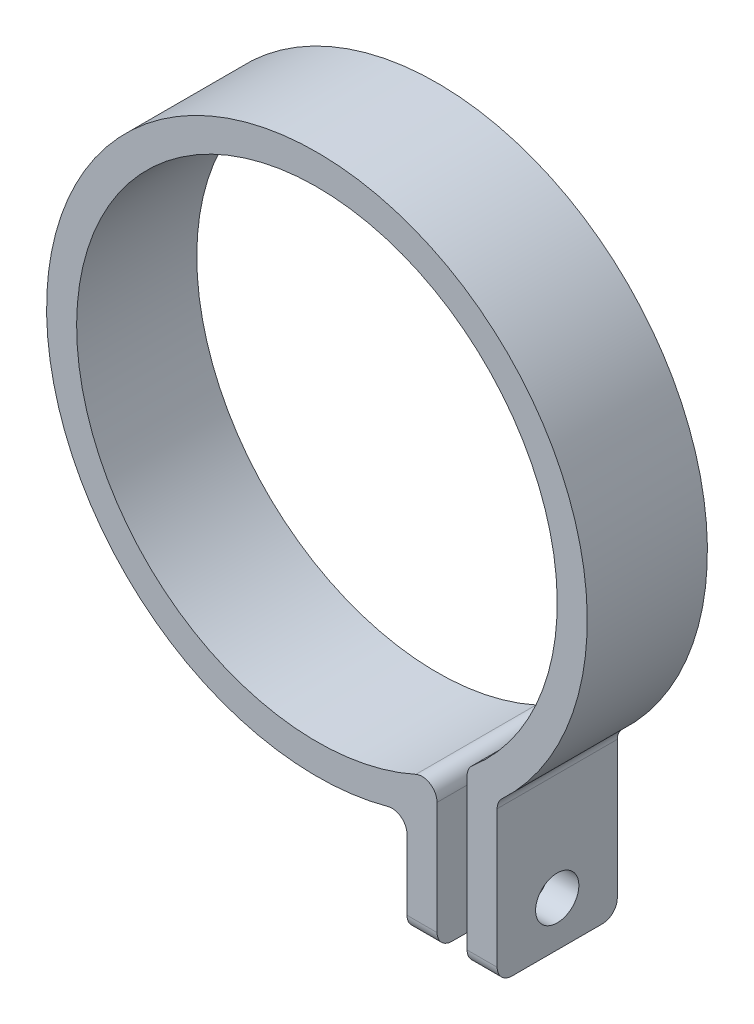
ISO-10303-21;
HEADER;
FILE_DESCRIPTION(('STEP AP214'),'2;1');
FILE_NAME('part.step','',(''),(''),'','','');
FILE_SCHEMA(('AUTOMOTIVE_DESIGN { 1 0 10303 214 1 1 1 1 }'));
ENDSEC;
DATA;
#1=APPLICATION_CONTEXT('core data for automotive mechanical design processes');
#2=APPLICATION_PROTOCOL_DEFINITION('international standard','automotive_design',2000,#1);
#3=PRODUCT_CONTEXT('',#1,'mechanical');
#4=PRODUCT('Part','Part','',(#3));
#5=PRODUCT_RELATED_PRODUCT_CATEGORY('part','',(#4));
#6=PRODUCT_DEFINITION_FORMATION('','',#4);
#7=PRODUCT_DEFINITION_CONTEXT('part definition',#1,'design');
#8=PRODUCT_DEFINITION('design','',#6,#7);
#9=PRODUCT_DEFINITION_SHAPE('','',#8);
#10=(LENGTH_UNIT() NAMED_UNIT(*) SI_UNIT(.MILLI.,.METRE.));
#11=(NAMED_UNIT(*) PLANE_ANGLE_UNIT() SI_UNIT($,.RADIAN.));
#12=(NAMED_UNIT(*) SI_UNIT($,.STERADIAN.) SOLID_ANGLE_UNIT());
#13=UNCERTAINTY_MEASURE_WITH_UNIT(LENGTH_MEASURE(1.E-05),#10,'distance_accuracy_value','');
#14=(GEOMETRIC_REPRESENTATION_CONTEXT(3) GLOBAL_UNCERTAINTY_ASSIGNED_CONTEXT((#13)) GLOBAL_UNIT_ASSIGNED_CONTEXT((#10,
#11,#12)) REPRESENTATION_CONTEXT('',''));
#15=CARTESIAN_POINT('',(0.,0.,0.));
#16=DIRECTION('',(0.,0.,1.));
#17=DIRECTION('',(1.,0.,0.));
#18=AXIS2_PLACEMENT_3D('',#15,#16,#17);
#19=CARTESIAN_POINT('',(0.,0.,6.35));
#20=DIRECTION('',(0.,0.,-1.));
#21=DIRECTION('',(-1.,0.,0.));
#22=AXIS2_PLACEMENT_3D('',#19,#20,#21);
#23=CYLINDRICAL_SURFACE('',#22,25.4);
#24=CARTESIAN_POINT('',(0.,0.,6.35));
#25=DIRECTION('',(0.,0.,-1.));
#26=DIRECTION('',(1.,0.,0.));
#27=AXIS2_PLACEMENT_3D('',#24,#25,#26);
#28=CIRCLE('',#27,25.4);
#29=CARTESIAN_POINT('',(10.4588235294118,-23.1467710573337,6.35));
#30=VERTEX_POINT('',#29);
#31=CARTESIAN_POINT('',(16.4352941176471,-19.365978087007,6.35));
#32=VERTEX_POINT('',#31);
#33=EDGE_CURVE('E338',#30,#32,#28,.T.);
#34=ORIENTED_EDGE('',*,*,#33,.F.);
#35=DIRECTION('',(0.,0.,-1.));
#36=VECTOR('',#35,1.);
#37=CARTESIAN_POINT('',(10.4588235294118,-23.1467710573337,6.35));
#38=LINE('',#37,#36);
#39=CARTESIAN_POINT('',(10.4588235294118,-23.1467710573337,-6.35));
#40=VERTEX_POINT('',#39);
#41=EDGE_CURVE('E273',#30,#40,#38,.T.);
#42=ORIENTED_EDGE('',*,*,#41,.T.);
#43=CARTESIAN_POINT('',(0.,0.,-6.35));
#44=DIRECTION('',(0.,0.,-1.));
#45=DIRECTION('',(1.,0.,0.));
#46=AXIS2_PLACEMENT_3D('',#43,#44,#45);
#47=CIRCLE('',#46,25.4);
#48=CARTESIAN_POINT('',(16.4352941176471,-19.365978087007,-6.35));
#49=VERTEX_POINT('',#48);
#50=EDGE_CURVE('E323',#40,#49,#47,.T.);
#51=ORIENTED_EDGE('',*,*,#50,.T.);
#52=DIRECTION('',(0.,0.,-1.));
#53=VECTOR('',#52,1.);
#54=CARTESIAN_POINT('',(16.4352941176471,-19.365978087007,6.35));
#55=LINE('',#54,#53);
#56=EDGE_CURVE('E270',#49,#32,#55,.F.);
#57=ORIENTED_EDGE('',*,*,#56,.T.);
#58=EDGE_LOOP('',(#34,#42,#51,#57));
#59=FACE_BOUND('',#58,.T.);
#60=ADVANCED_FACE('F45',(#59),#23,.F.);
#61=CARTESIAN_POINT('',(15.875,-19.8278686449149,6.35));
#62=DIRECTION('',(1.,0.,0.));
#63=DIRECTION('',(0.,1.,0.));
#64=AXIS2_PLACEMENT_3D('',#61,#62,#63);
#65=PLANE('',#64);
#66=CARTESIAN_POINT('',(15.875,-33.3375,0.));
#67=DIRECTION('',(1.,0.,0.));
#68=DIRECTION('',(0.,1.,0.));
#69=AXIS2_PLACEMENT_3D('',#66,#67,#68);
#70=CIRCLE('',#69,2.286);
#71=CARTESIAN_POINT('',(15.875,-31.0515,0.));
#72=VERTEX_POINT('',#71);
#73=EDGE_CURVE('E326',#72,#72,#70,.T.);
#74=ORIENTED_EDGE('',*,*,#73,.T.);
#75=EDGE_LOOP('',(#74));
#76=FACE_BOUND('',#75,.T.);
#77=DIRECTION('',(0.,-1.,0.));
#78=VECTOR('',#77,1.);
#79=CARTESIAN_POINT('',(15.875,-19.8278686449149,-6.35));
#80=LINE('',#79,#78);
#81=CARTESIAN_POINT('',(15.875,-20.576351717445,-6.35));
#82=VERTEX_POINT('',#81);
#83=CARTESIAN_POINT('',(15.875,-36.5125,-6.35));
#84=VERTEX_POINT('',#83);
#85=EDGE_CURVE('E301',#82,#84,#80,.T.);
#86=ORIENTED_EDGE('',*,*,#85,.T.);
#87=CARTESIAN_POINT('',(15.875,-36.5125,-4.7625));
#88=DIRECTION('',(1.,0.,0.));
#89=DIRECTION('',(0.,1.,0.));
#90=AXIS2_PLACEMENT_3D('',#87,#88,#89);
#91=CIRCLE('',#90,1.5875);
#92=CARTESIAN_POINT('',(15.875,-38.1,-4.7625));
#93=VERTEX_POINT('',#92);
#94=EDGE_CURVE('E250',#84,#93,#91,.F.);
#95=ORIENTED_EDGE('',*,*,#94,.T.);
#96=DIRECTION('',(0.,0.,-1.));
#97=VECTOR('',#96,1.);
#98=CARTESIAN_POINT('',(15.875,-38.1,6.35));
#99=LINE('',#98,#97);
#100=CARTESIAN_POINT('',(15.875,-38.1,4.7625));
#101=VERTEX_POINT('',#100);
#102=EDGE_CURVE('E202',#101,#93,#99,.T.);
#103=ORIENTED_EDGE('',*,*,#102,.F.);
#104=CARTESIAN_POINT('',(15.875,-36.5125,4.7625));
#105=DIRECTION('',(1.,0.,0.));
#106=DIRECTION('',(0.,1.,0.));
#107=AXIS2_PLACEMENT_3D('',#104,#105,#106);
#108=CIRCLE('',#107,1.5875);
#109=CARTESIAN_POINT('',(15.875,-36.5125,6.35));
#110=VERTEX_POINT('',#109);
#111=EDGE_CURVE('E248',#101,#110,#108,.F.);
#112=ORIENTED_EDGE('',*,*,#111,.T.);
#113=DIRECTION('',(0.,-1.,0.));
#114=VECTOR('',#113,1.);
#115=CARTESIAN_POINT('',(15.875,-19.8278686449149,6.35));
#116=LINE('',#115,#114);
#117=CARTESIAN_POINT('',(15.875,-20.576351717445,6.35));
#118=VERTEX_POINT('',#117);
#119=EDGE_CURVE('E317',#118,#110,#116,.T.);
#120=ORIENTED_EDGE('',*,*,#119,.F.);
#121=DIRECTION('',(0.,0.,-1.));
#122=VECTOR('',#121,1.);
#123=CARTESIAN_POINT('',(15.875,-20.576351717445,6.35));
#124=LINE('',#123,#122);
#125=EDGE_CURVE('E244',#118,#82,#124,.T.);
#126=ORIENTED_EDGE('',*,*,#125,.T.);
#127=EDGE_LOOP('',(#86,#95,#103,#112,#120,#126));
#128=FACE_BOUND('',#127,.T.);
#129=ADVANCED_FACE('F354',(#76,#128),#65,.F.);
#130=CARTESIAN_POINT('',(15.875,-38.1,6.35));
#131=DIRECTION('',(0.,1.,0.));
#132=DIRECTION('',(0.,0.,1.));
#133=AXIS2_PLACEMENT_3D('',#130,#131,#132);
#134=PLANE('',#133);
#135=ORIENTED_EDGE('',*,*,#102,.T.);
#136=DIRECTION('',(1.,0.,0.));
#137=VECTOR('',#136,1.);
#138=CARTESIAN_POINT('',(15.875,-38.1,-4.7625));
#139=LINE('',#138,#137);
#140=CARTESIAN_POINT('',(19.05,-38.1,-4.7625));
#141=VERTEX_POINT('',#140);
#142=EDGE_CURVE('E234',#93,#141,#139,.T.);
#143=ORIENTED_EDGE('',*,*,#142,.T.);
#144=DIRECTION('',(0.,0.,-1.));
#145=VECTOR('',#144,1.);
#146=CARTESIAN_POINT('',(19.05,-38.1,6.35));
#147=LINE('',#146,#145);
#148=CARTESIAN_POINT('',(19.05,-38.1,4.7625));
#149=VERTEX_POINT('',#148);
#150=EDGE_CURVE('E206',#149,#141,#147,.T.);
#151=ORIENTED_EDGE('',*,*,#150,.F.);
#152=DIRECTION('',(1.,0.,0.));
#153=VECTOR('',#152,1.);
#154=CARTESIAN_POINT('',(15.875,-38.1,4.7625));
#155=LINE('',#154,#153);
#156=EDGE_CURVE('E232',#149,#101,#155,.F.);
#157=ORIENTED_EDGE('',*,*,#156,.T.);
#158=EDGE_LOOP('',(#135,#143,#151,#157));
#159=FACE_BOUND('',#158,.T.);
#160=ADVANCED_FACE('F344',(#159),#134,.F.);
#161=CARTESIAN_POINT('',(19.05,-38.1,6.35));
#162=DIRECTION('',(-1.,0.,0.));
#163=DIRECTION('',(0.,0.,1.));
#164=AXIS2_PLACEMENT_3D('',#161,#162,#163);
#165=PLANE('',#164);
#166=CARTESIAN_POINT('',(19.05,-33.3375,0.));
#167=DIRECTION('',(-1.,0.,0.));
#168=DIRECTION('',(0.,0.,1.));
#169=AXIS2_PLACEMENT_3D('',#166,#167,#168);
#170=CIRCLE('',#169,2.286);
#171=CARTESIAN_POINT('',(19.05,-33.3375,2.286));
#172=VERTEX_POINT('',#171);
#173=EDGE_CURVE('E364',#172,#172,#170,.T.);
#174=ORIENTED_EDGE('',*,*,#173,.T.);
#175=EDGE_LOOP('',(#174));
#176=FACE_BOUND('',#175,.T.);
#177=ORIENTED_EDGE('',*,*,#150,.T.);
#178=CARTESIAN_POINT('',(19.05,-36.5125,-4.7625));
#179=DIRECTION('',(-1.,0.,0.));
#180=DIRECTION('',(0.,0.,1.));
#181=AXIS2_PLACEMENT_3D('',#178,#179,#180);
#182=CIRCLE('',#181,1.5875);
#183=CARTESIAN_POINT('',(19.05,-36.5125,-6.35));
#184=VERTEX_POINT('',#183);
#185=EDGE_CURVE('E242',#141,#184,#182,.F.);
#186=ORIENTED_EDGE('',*,*,#185,.T.);
#187=DIRECTION('',(0.,1.,0.));
#188=VECTOR('',#187,1.);
#189=CARTESIAN_POINT('',(19.05,-38.1,-6.35));
#190=LINE('',#189,#188);
#191=CARTESIAN_POINT('',(19.05,-21.9970452561247,-6.35));
#192=VERTEX_POINT('',#191);
#193=EDGE_CURVE('E291',#184,#192,#190,.T.);
#194=ORIENTED_EDGE('',*,*,#193,.T.);
#195=DIRECTION('',(0.,0.,1.));
#196=VECTOR('',#195,1.);
#197=CARTESIAN_POINT('',(19.05,-21.9970452561247,6.35));
#198=LINE('',#197,#196);
#199=CARTESIAN_POINT('',(19.05,-21.9970452561247,6.35));
#200=VERTEX_POINT('',#199);
#201=EDGE_CURVE('E237',#192,#200,#198,.T.);
#202=ORIENTED_EDGE('',*,*,#201,.T.);
#203=DIRECTION('',(0.,1.,0.));
#204=VECTOR('',#203,1.);
#205=CARTESIAN_POINT('',(19.05,-38.1,6.35));
#206=LINE('',#205,#204);
#207=CARTESIAN_POINT('',(19.05,-36.5125,6.35));
#208=VERTEX_POINT('',#207);
#209=EDGE_CURVE('E309',#208,#200,#206,.T.);
#210=ORIENTED_EDGE('',*,*,#209,.F.);
#211=CARTESIAN_POINT('',(19.05,-36.5125,4.7625));
#212=DIRECTION('',(-1.,0.,0.));
#213=DIRECTION('',(0.,0.,1.));
#214=AXIS2_PLACEMENT_3D('',#211,#212,#213);
#215=CIRCLE('',#214,1.5875);
#216=EDGE_CURVE('E240',#208,#149,#215,.F.);
#217=ORIENTED_EDGE('',*,*,#216,.T.);
#218=EDGE_LOOP('',(#177,#186,#194,#202,#210,#217));
#219=FACE_BOUND('',#218,.T.);
#220=ADVANCED_FACE('F299',(#176,#219),#165,.F.);
#221=CARTESIAN_POINT('',(0.,0.,6.35));
#222=DIRECTION('',(0.,0.,-1.));
#223=DIRECTION('',(-1.,0.,0.));
#224=AXIS2_PLACEMENT_3D('',#221,#222,#223);
#225=CYLINDRICAL_SURFACE('',#224,28.575);
#226=CARTESIAN_POINT('',(0.,0.,-6.35));
#227=DIRECTION('',(0.,0.,1.));
#228=DIRECTION('',(1.,0.,0.));
#229=AXIS2_PLACEMENT_3D('',#226,#227,#228);
#230=CIRCLE('',#229,28.575);
#231=CARTESIAN_POINT('',(19.5513157894737,-20.8393060321182,-6.35));
#232=VERTEX_POINT('',#231);
#233=CARTESIAN_POINT('',(7.51973684210527,-27.5678106280765,-6.35));
#234=VERTEX_POINT('',#233);
#235=EDGE_CURVE('E293',#232,#234,#230,.T.);
#236=ORIENTED_EDGE('',*,*,#235,.T.);
#237=DIRECTION('',(0.,0.,-1.));
#238=VECTOR('',#237,1.);
#239=CARTESIAN_POINT('',(7.51973684210527,-27.5678106280765,6.35));
#240=LINE('',#239,#238);
#241=CARTESIAN_POINT('',(7.51973684210527,-27.5678106280765,6.35));
#242=VERTEX_POINT('',#241);
#243=EDGE_CURVE('E63',#234,#242,#240,.F.);
#244=ORIENTED_EDGE('',*,*,#243,.T.);
#245=CARTESIAN_POINT('',(0.,0.,6.35));
#246=DIRECTION('',(0.,0.,1.));
#247=DIRECTION('',(1.,0.,0.));
#248=AXIS2_PLACEMENT_3D('',#245,#246,#247);
#249=CIRCLE('',#248,28.575);
#250=CARTESIAN_POINT('',(19.5513157894737,-20.8393060321182,6.35));
#251=VERTEX_POINT('',#250);
#252=EDGE_CURVE('E305',#251,#242,#249,.T.);
#253=ORIENTED_EDGE('',*,*,#252,.F.);
#254=DIRECTION('',(0.,0.,-1.));
#255=VECTOR('',#254,1.);
#256=CARTESIAN_POINT('',(19.5513157894737,-20.8393060321182,6.35));
#257=LINE('',#256,#255);
#258=EDGE_CURVE('E264',#251,#232,#257,.T.);
#259=ORIENTED_EDGE('',*,*,#258,.T.);
#260=EDGE_LOOP('',(#236,#244,#253,#259));
#261=FACE_BOUND('',#260,.T.);
#262=ADVANCED_FACE('F304',(#261),#225,.T.);
#263=CARTESIAN_POINT('',(9.525,-26.9407683632075,6.35));
#264=DIRECTION('',(1.,0.,0.));
#265=DIRECTION('',(0.,1.,0.));
#266=AXIS2_PLACEMENT_3D('',#263,#264,#265);
#267=PLANE('',#266);
#268=CARTESIAN_POINT('',(9.52500000000001,-33.3375,0.));
#269=DIRECTION('',(-1.,0.,0.));
#270=DIRECTION('',(0.,-1.,0.));
#271=AXIS2_PLACEMENT_3D('',#268,#269,#270);
#272=CIRCLE('',#271,2.286);
#273=CARTESIAN_POINT('',(9.52500000000001,-35.6235,0.));
#274=VERTEX_POINT('',#273);
#275=EDGE_CURVE('E367',#274,#274,#272,.T.);
#276=ORIENTED_EDGE('',*,*,#275,.F.);
#277=EDGE_LOOP('',(#276));
#278=FACE_BOUND('',#277,.T.);
#279=DIRECTION('',(0.,-1.,0.));
#280=VECTOR('',#279,1.);
#281=CARTESIAN_POINT('',(9.525,-26.9407683632075,-6.35));
#282=LINE('',#281,#280);
#283=CARTESIAN_POINT('',(9.525,-29.0993556629696,-6.35));
#284=VERTEX_POINT('',#283);
#285=CARTESIAN_POINT('',(9.52500000000001,-36.5125,-6.35));
#286=VERTEX_POINT('',#285);
#287=EDGE_CURVE('E331',#284,#286,#282,.T.);
#288=ORIENTED_EDGE('',*,*,#287,.T.);
#289=CARTESIAN_POINT('',(9.52500000000001,-36.5125,-4.7625));
#290=DIRECTION('',(1.,0.,0.));
#291=DIRECTION('',(0.,1.,0.));
#292=AXIS2_PLACEMENT_3D('',#289,#290,#291);
#293=CIRCLE('',#292,1.5875);
#294=CARTESIAN_POINT('',(9.52500000000001,-38.1,-4.7625));
#295=VERTEX_POINT('',#294);
#296=EDGE_CURVE('E230',#286,#295,#293,.F.);
#297=ORIENTED_EDGE('',*,*,#296,.T.);
#298=DIRECTION('',(0.,0.,-1.));
#299=VECTOR('',#298,1.);
#300=CARTESIAN_POINT('',(9.52500000000001,-38.1,6.35));
#301=LINE('',#300,#299);
#302=CARTESIAN_POINT('',(9.52500000000001,-38.1,4.7625));
#303=VERTEX_POINT('',#302);
#304=EDGE_CURVE('E197',#303,#295,#301,.T.);
#305=ORIENTED_EDGE('',*,*,#304,.F.);
#306=CARTESIAN_POINT('',(9.52500000000001,-36.5125,4.7625));
#307=DIRECTION('',(1.,0.,0.));
#308=DIRECTION('',(0.,1.,0.));
#309=AXIS2_PLACEMENT_3D('',#306,#307,#308);
#310=CIRCLE('',#309,1.5875);
#311=CARTESIAN_POINT('',(9.52500000000001,-36.5125,6.35));
#312=VERTEX_POINT('',#311);
#313=EDGE_CURVE('E201',#303,#312,#310,.F.);
#314=ORIENTED_EDGE('',*,*,#313,.T.);
#315=DIRECTION('',(0.,-1.,0.));
#316=VECTOR('',#315,1.);
#317=CARTESIAN_POINT('',(9.525,-26.9407683632075,6.35));
#318=LINE('',#317,#316);
#319=CARTESIAN_POINT('',(9.525,-29.0993556629696,6.35));
#320=VERTEX_POINT('',#319);
#321=EDGE_CURVE('E308',#320,#312,#318,.T.);
#322=ORIENTED_EDGE('',*,*,#321,.F.);
#323=DIRECTION('',(0.,0.,1.));
#324=VECTOR('',#323,1.);
#325=CARTESIAN_POINT('',(9.525,-29.0993556629696,-6.35));
#326=LINE('',#325,#324);
#327=EDGE_CURVE('E224',#320,#284,#326,.F.);
#328=ORIENTED_EDGE('',*,*,#327,.T.);
#329=EDGE_LOOP('',(#288,#297,#305,#314,#322,#328));
#330=FACE_BOUND('',#329,.T.);
#331=ADVANCED_FACE('F434',(#278,#330),#267,.F.);
#332=CARTESIAN_POINT('',(9.52500000000001,-38.1,6.35));
#333=DIRECTION('',(0.,1.,0.));
#334=DIRECTION('',(0.,0.,1.));
#335=AXIS2_PLACEMENT_3D('',#332,#333,#334);
#336=PLANE('',#335);
#337=ORIENTED_EDGE('',*,*,#304,.T.);
#338=DIRECTION('',(1.,0.,0.));
#339=VECTOR('',#338,1.);
#340=CARTESIAN_POINT('',(9.52500000000001,-38.1,-4.7625));
#341=LINE('',#340,#339);
#342=CARTESIAN_POINT('',(12.7,-38.1,-4.7625));
#343=VERTEX_POINT('',#342);
#344=EDGE_CURVE('E196',#295,#343,#341,.T.);
#345=ORIENTED_EDGE('',*,*,#344,.T.);
#346=DIRECTION('',(0.,0.,-1.));
#347=VECTOR('',#346,1.);
#348=CARTESIAN_POINT('',(12.7,-38.1,6.35));
#349=LINE('',#348,#347);
#350=CARTESIAN_POINT('',(12.7,-38.1,4.7625));
#351=VERTEX_POINT('',#350);
#352=EDGE_CURVE('E179',#351,#343,#349,.T.);
#353=ORIENTED_EDGE('',*,*,#352,.F.);
#354=DIRECTION('',(1.,0.,0.));
#355=VECTOR('',#354,1.);
#356=CARTESIAN_POINT('',(9.52500000000001,-38.1,4.7625));
#357=LINE('',#356,#355);
#358=EDGE_CURVE('E193',#351,#303,#357,.F.);
#359=ORIENTED_EDGE('',*,*,#358,.T.);
#360=EDGE_LOOP('',(#337,#345,#353,#359));
#361=FACE_BOUND('',#360,.T.);
#362=ADVANCED_FACE('F192',(#361),#336,.F.);
#363=CARTESIAN_POINT('',(12.7,-21.9970452561247,6.35));
#364=DIRECTION('',(-1.,0.,0.));
#365=DIRECTION('',(0.,0.,1.));
#366=AXIS2_PLACEMENT_3D('',#363,#364,#365);
#367=PLANE('',#366);
#368=CARTESIAN_POINT('',(12.7,-33.3375,0.));
#369=DIRECTION('',(-1.,0.,0.));
#370=DIRECTION('',(0.,0.,1.));
#371=AXIS2_PLACEMENT_3D('',#368,#369,#370);
#372=CIRCLE('',#371,2.286);
#373=CARTESIAN_POINT('',(12.7,-33.3375,2.286));
#374=VERTEX_POINT('',#373);
#375=EDGE_CURVE('E209',#374,#374,#372,.T.);
#376=ORIENTED_EDGE('',*,*,#375,.T.);
#377=EDGE_LOOP('',(#376));
#378=FACE_BOUND('',#377,.T.);
#379=ORIENTED_EDGE('',*,*,#352,.T.);
#380=CARTESIAN_POINT('',(12.7,-36.5125,-4.7625));
#381=DIRECTION('',(-1.,0.,0.));
#382=DIRECTION('',(0.,0.,1.));
#383=AXIS2_PLACEMENT_3D('',#380,#381,#382);
#384=CIRCLE('',#383,1.5875);
#385=CARTESIAN_POINT('',(12.7,-36.5125,-6.35));
#386=VERTEX_POINT('',#385);
#387=EDGE_CURVE('E186',#343,#386,#384,.F.);
#388=ORIENTED_EDGE('',*,*,#387,.T.);
#389=DIRECTION('',(0.,1.,0.));
#390=VECTOR('',#389,1.);
#391=CARTESIAN_POINT('',(12.7,-21.9970452561247,-6.35));
#392=LINE('',#391,#390);
#393=CARTESIAN_POINT('',(12.7,-24.5934442484171,-6.35));
#394=VERTEX_POINT('',#393);
#395=EDGE_CURVE('E335',#386,#394,#392,.T.);
#396=ORIENTED_EDGE('',*,*,#395,.T.);
#397=DIRECTION('',(0.,0.,-1.));
#398=VECTOR('',#397,1.);
#399=CARTESIAN_POINT('',(12.7,-24.5934442484171,6.35));
#400=LINE('',#399,#398);
#401=CARTESIAN_POINT('',(12.7,-24.5934442484171,6.35));
#402=VERTEX_POINT('',#401);
#403=EDGE_CURVE('E187',#394,#402,#400,.F.);
#404=ORIENTED_EDGE('',*,*,#403,.T.);
#405=DIRECTION('',(0.,1.,0.));
#406=VECTOR('',#405,1.);
#407=CARTESIAN_POINT('',(12.7,-21.9970452561247,6.35));
#408=LINE('',#407,#406);
#409=CARTESIAN_POINT('',(12.7,-36.5125,6.35));
#410=VERTEX_POINT('',#409);
#411=EDGE_CURVE('E181',#410,#402,#408,.T.);
#412=ORIENTED_EDGE('',*,*,#411,.F.);
#413=CARTESIAN_POINT('',(12.7,-36.5125,4.7625));
#414=DIRECTION('',(-1.,0.,0.));
#415=DIRECTION('',(0.,0.,1.));
#416=AXIS2_PLACEMENT_3D('',#413,#414,#415);
#417=CIRCLE('',#416,1.5875);
#418=EDGE_CURVE('E176',#410,#351,#417,.F.);
#419=ORIENTED_EDGE('',*,*,#418,.T.);
#420=EDGE_LOOP('',(#379,#388,#396,#404,#412,#419));
#421=FACE_BOUND('',#420,.T.);
#422=ADVANCED_FACE('F178',(#378,#421),#367,.F.);
#423=CARTESIAN_POINT('',(0.,0.,6.35));
#424=DIRECTION('',(0.,0.,1.));
#425=DIRECTION('',(1.,0.,0.));
#426=AXIS2_PLACEMENT_3D('',#423,#424,#425);
#427=PLANE('',#426);
#428=ORIENTED_EDGE('',*,*,#321,.T.);
#429=DIRECTION('',(1.,0.,0.));
#430=VECTOR('',#429,1.);
#431=CARTESIAN_POINT('',(12.7,-36.5125,6.35));
#432=LINE('',#431,#430);
#433=EDGE_CURVE('E261',#312,#410,#432,.T.);
#434=ORIENTED_EDGE('',*,*,#433,.T.);
#435=ORIENTED_EDGE('',*,*,#411,.T.);
#436=CARTESIAN_POINT('',(11.1125,-24.5934442484171,6.35));
#437=DIRECTION('',(0.,0.,1.));
#438=DIRECTION('',(1.,0.,0.));
#439=AXIS2_PLACEMENT_3D('',#436,#437,#438);
#440=CIRCLE('',#439,1.5875);
#441=EDGE_CURVE('E255',#402,#30,#440,.T.);
#442=ORIENTED_EDGE('',*,*,#441,.T.);
#443=ORIENTED_EDGE('',*,*,#33,.T.);
#444=CARTESIAN_POINT('',(17.4625,-20.576351717445,6.35));
#445=DIRECTION('',(0.,0.,1.));
#446=DIRECTION('',(1.,0.,0.));
#447=AXIS2_PLACEMENT_3D('',#444,#445,#446);
#448=CIRCLE('',#447,1.5875);
#449=EDGE_CURVE('E252',#32,#118,#448,.T.);
#450=ORIENTED_EDGE('',*,*,#449,.T.);
#451=ORIENTED_EDGE('',*,*,#119,.T.);
#452=DIRECTION('',(1.,0.,0.));
#453=VECTOR('',#452,1.);
#454=CARTESIAN_POINT('',(19.05,-36.5125,6.35));
#455=LINE('',#454,#453);
#456=EDGE_CURVE('E258',#110,#208,#455,.T.);
#457=ORIENTED_EDGE('',*,*,#456,.T.);
#458=ORIENTED_EDGE('',*,*,#209,.T.);
#459=CARTESIAN_POINT('',(20.6375,-21.9970452561247,6.35));
#460=DIRECTION('',(0.,0.,1.));
#461=DIRECTION('',(1.,0.,0.));
#462=AXIS2_PLACEMENT_3D('',#459,#460,#461);
#463=CIRCLE('',#462,1.5875);
#464=EDGE_CURVE('E11',#200,#251,#463,.F.);
#465=ORIENTED_EDGE('',*,*,#464,.T.);
#466=ORIENTED_EDGE('',*,*,#252,.T.);
#467=CARTESIAN_POINT('',(7.93750000000001,-29.0993556629696,6.35));
#468=DIRECTION('',(0.,0.,1.));
#469=DIRECTION('',(1.,0.,0.));
#470=AXIS2_PLACEMENT_3D('',#467,#468,#469);
#471=CIRCLE('',#470,1.5875);
#472=EDGE_CURVE('E280',#242,#320,#471,.F.);
#473=ORIENTED_EDGE('',*,*,#472,.T.);
#474=EDGE_LOOP('',(#428,#434,#435,#442,#443,#450,#451,#457,#458,#465,#466,#473));
#475=FACE_BOUND('',#474,.T.);
#476=ADVANCED_FACE('F356',(#475),#427,.T.);
#477=CARTESIAN_POINT('',(0.,0.,-6.35));
#478=DIRECTION('',(0.,0.,1.));
#479=DIRECTION('',(1.,0.,0.));
#480=AXIS2_PLACEMENT_3D('',#477,#478,#479);
#481=PLANE('',#480);
#482=ORIENTED_EDGE('',*,*,#395,.F.);
#483=DIRECTION('',(1.,0.,0.));
#484=VECTOR('',#483,1.);
#485=CARTESIAN_POINT('',(0.,-36.5125,-6.35));
#486=LINE('',#485,#484);
#487=EDGE_CURVE('E222',#386,#286,#486,.F.);
#488=ORIENTED_EDGE('',*,*,#487,.T.);
#489=ORIENTED_EDGE('',*,*,#287,.F.);
#490=CARTESIAN_POINT('',(7.93750000000001,-29.0993556629696,-6.35));
#491=DIRECTION('',(0.,0.,1.));
#492=DIRECTION('',(1.,0.,0.));
#493=AXIS2_PLACEMENT_3D('',#490,#491,#492);
#494=CIRCLE('',#493,1.5875);
#495=EDGE_CURVE('E277',#284,#234,#494,.T.);
#496=ORIENTED_EDGE('',*,*,#495,.T.);
#497=ORIENTED_EDGE('',*,*,#235,.F.);
#498=CARTESIAN_POINT('',(20.6375,-21.9970452561247,-6.35));
#499=DIRECTION('',(0.,0.,1.));
#500=DIRECTION('',(1.,0.,0.));
#501=AXIS2_PLACEMENT_3D('',#498,#499,#500);
#502=CIRCLE('',#501,1.5875);
#503=EDGE_CURVE('E54',#232,#192,#502,.T.);
#504=ORIENTED_EDGE('',*,*,#503,.T.);
#505=ORIENTED_EDGE('',*,*,#193,.F.);
#506=DIRECTION('',(1.,0.,0.));
#507=VECTOR('',#506,1.);
#508=CARTESIAN_POINT('',(0.,-36.5125,-6.35));
#509=LINE('',#508,#507);
#510=EDGE_CURVE('E220',#184,#84,#509,.F.);
#511=ORIENTED_EDGE('',*,*,#510,.T.);
#512=ORIENTED_EDGE('',*,*,#85,.F.);
#513=CARTESIAN_POINT('',(17.4625,-20.576351717445,-6.35));
#514=DIRECTION('',(0.,0.,1.));
#515=DIRECTION('',(1.,0.,0.));
#516=AXIS2_PLACEMENT_3D('',#513,#514,#515);
#517=CIRCLE('',#516,1.5875);
#518=EDGE_CURVE('E214',#82,#49,#517,.F.);
#519=ORIENTED_EDGE('',*,*,#518,.T.);
#520=ORIENTED_EDGE('',*,*,#50,.F.);
#521=CARTESIAN_POINT('',(11.1125,-24.5934442484171,-6.35));
#522=DIRECTION('',(0.,0.,1.));
#523=DIRECTION('',(1.,0.,0.));
#524=AXIS2_PLACEMENT_3D('',#521,#522,#523);
#525=CIRCLE('',#524,1.5875);
#526=EDGE_CURVE('E217',#40,#394,#525,.F.);
#527=ORIENTED_EDGE('',*,*,#526,.T.);
#528=EDGE_LOOP('',(#482,#488,#489,#496,#497,#504,#505,#511,#512,#519,#520,#527));
#529=FACE_BOUND('',#528,.T.);
#530=ADVANCED_FACE('F290',(#529),#481,.F.);
#531=CARTESIAN_POINT('',(28.575,-33.3375,0.));
#532=DIRECTION('',(-1.,0.,0.));
#533=DIRECTION('',(0.,-1.,0.));
#534=AXIS2_PLACEMENT_3D('',#531,#532,#533);
#535=CYLINDRICAL_SURFACE('',#534,2.286);
#536=ORIENTED_EDGE('',*,*,#275,.T.);
#537=EDGE_LOOP('',(#536));
#538=FACE_BOUND('',#537,.T.);
#539=ORIENTED_EDGE('',*,*,#375,.F.);
#540=EDGE_LOOP('',(#539));
#541=FACE_BOUND('',#540,.T.);
#542=ADVANCED_FACE('F377',(#538,#541),#535,.F.);
#543=ORIENTED_EDGE('',*,*,#173,.F.);
#544=EDGE_LOOP('',(#543));
#545=FACE_BOUND('',#544,.T.);
#546=ORIENTED_EDGE('',*,*,#73,.F.);
#547=EDGE_LOOP('',(#546));
#548=FACE_BOUND('',#547,.T.);
#549=ADVANCED_FACE('F379',(#545,#548),#535,.F.);
#550=CARTESIAN_POINT('',(9.52500000000001,-36.5125,-4.7625));
#551=DIRECTION('',(1.,0.,0.));
#552=DIRECTION('',(0.,0.,-1.));
#553=AXIS2_PLACEMENT_3D('',#550,#551,#552);
#554=CYLINDRICAL_SURFACE('',#553,1.5875);
#555=ORIENTED_EDGE('',*,*,#296,.F.);
#556=ORIENTED_EDGE('',*,*,#487,.F.);
#557=ORIENTED_EDGE('',*,*,#387,.F.);
#558=ORIENTED_EDGE('',*,*,#344,.F.);
#559=EDGE_LOOP('',(#555,#556,#557,#558));
#560=FACE_BOUND('',#559,.T.);
#561=ADVANCED_FACE('F384',(#560),#554,.T.);
#562=CARTESIAN_POINT('',(15.875,-36.5125,-4.7625));
#563=DIRECTION('',(1.,0.,0.));
#564=DIRECTION('',(0.,0.,-1.));
#565=AXIS2_PLACEMENT_3D('',#562,#563,#564);
#566=CYLINDRICAL_SURFACE('',#565,1.5875);
#567=ORIENTED_EDGE('',*,*,#94,.F.);
#568=ORIENTED_EDGE('',*,*,#510,.F.);
#569=ORIENTED_EDGE('',*,*,#185,.F.);
#570=ORIENTED_EDGE('',*,*,#142,.F.);
#571=EDGE_LOOP('',(#567,#568,#569,#570));
#572=FACE_BOUND('',#571,.T.);
#573=ADVANCED_FACE('F402',(#572),#566,.T.);
#574=CARTESIAN_POINT('',(0.,-36.5125,4.7625));
#575=DIRECTION('',(-1.,0.,0.));
#576=DIRECTION('',(0.,0.,1.));
#577=AXIS2_PLACEMENT_3D('',#574,#575,#576);
#578=CYLINDRICAL_SURFACE('',#577,1.5875);
#579=ORIENTED_EDGE('',*,*,#313,.F.);
#580=ORIENTED_EDGE('',*,*,#358,.F.);
#581=ORIENTED_EDGE('',*,*,#418,.F.);
#582=ORIENTED_EDGE('',*,*,#433,.F.);
#583=EDGE_LOOP('',(#579,#580,#581,#582));
#584=FACE_BOUND('',#583,.T.);
#585=ADVANCED_FACE('F200',(#584),#578,.T.);
#586=CARTESIAN_POINT('',(0.,-36.5125,4.7625));
#587=DIRECTION('',(-1.,0.,0.));
#588=DIRECTION('',(0.,0.,1.));
#589=AXIS2_PLACEMENT_3D('',#586,#587,#588);
#590=CYLINDRICAL_SURFACE('',#589,1.5875);
#591=ORIENTED_EDGE('',*,*,#111,.F.);
#592=ORIENTED_EDGE('',*,*,#156,.F.);
#593=ORIENTED_EDGE('',*,*,#216,.F.);
#594=ORIENTED_EDGE('',*,*,#456,.F.);
#595=EDGE_LOOP('',(#591,#592,#593,#594));
#596=FACE_BOUND('',#595,.T.);
#597=ADVANCED_FACE('F349',(#596),#590,.T.);
#598=CARTESIAN_POINT('',(7.93750000000001,-29.0993556629696,6.35));
#599=DIRECTION('',(0.,0.,-1.));
#600=DIRECTION('',(-1.,0.,0.));
#601=AXIS2_PLACEMENT_3D('',#598,#599,#600);
#602=CYLINDRICAL_SURFACE('',#601,1.5875);
#603=ORIENTED_EDGE('',*,*,#472,.F.);
#604=ORIENTED_EDGE('',*,*,#243,.F.);
#605=ORIENTED_EDGE('',*,*,#495,.F.);
#606=ORIENTED_EDGE('',*,*,#327,.F.);
#607=EDGE_LOOP('',(#603,#604,#605,#606));
#608=FACE_BOUND('',#607,.T.);
#609=ADVANCED_FACE('F411',(#608),#602,.F.);
#610=CARTESIAN_POINT('',(20.6375,-21.9970452561247,6.35));
#611=DIRECTION('',(0.,0.,-1.));
#612=DIRECTION('',(-1.,0.,0.));
#613=AXIS2_PLACEMENT_3D('',#610,#611,#612);
#614=CYLINDRICAL_SURFACE('',#613,1.5875);
#615=ORIENTED_EDGE('',*,*,#464,.F.);
#616=ORIENTED_EDGE('',*,*,#201,.F.);
#617=ORIENTED_EDGE('',*,*,#503,.F.);
#618=ORIENTED_EDGE('',*,*,#258,.F.);
#619=EDGE_LOOP('',(#615,#616,#617,#618));
#620=FACE_BOUND('',#619,.T.);
#621=ADVANCED_FACE('F303',(#620),#614,.F.);
#622=CARTESIAN_POINT('',(11.1125,-24.5934442484171,6.35));
#623=DIRECTION('',(0.,0.,-1.));
#624=DIRECTION('',(-1.,0.,0.));
#625=AXIS2_PLACEMENT_3D('',#622,#623,#624);
#626=CYLINDRICAL_SURFACE('',#625,1.5875);
#627=ORIENTED_EDGE('',*,*,#441,.F.);
#628=ORIENTED_EDGE('',*,*,#403,.F.);
#629=ORIENTED_EDGE('',*,*,#526,.F.);
#630=ORIENTED_EDGE('',*,*,#41,.F.);
#631=EDGE_LOOP('',(#627,#628,#629,#630));
#632=FACE_BOUND('',#631,.T.);
#633=ADVANCED_FACE('F416',(#632),#626,.T.);
#634=CARTESIAN_POINT('',(17.4625,-20.576351717445,6.35));
#635=DIRECTION('',(0.,0.,-1.));
#636=DIRECTION('',(-1.,0.,0.));
#637=AXIS2_PLACEMENT_3D('',#634,#635,#636);
#638=CYLINDRICAL_SURFACE('',#637,1.5875);
#639=ORIENTED_EDGE('',*,*,#449,.F.);
#640=ORIENTED_EDGE('',*,*,#56,.F.);
#641=ORIENTED_EDGE('',*,*,#518,.F.);
#642=ORIENTED_EDGE('',*,*,#125,.F.);
#643=EDGE_LOOP('',(#639,#640,#641,#642));
#644=FACE_BOUND('',#643,.T.);
#645=ADVANCED_FACE('F47',(#644),#638,.T.);
#646=CLOSED_SHELL('',(#60,#129,#160,#220,#262,#331,#362,#422,#476,#530,#542,#549,#561,#573,#585,
#597,#609,#621,#633,#645));
#647=MANIFOLD_SOLID_BREP('B2',#646);
#648=ADVANCED_BREP_SHAPE_REPRESENTATION('',(#18,#647),#14);
#649=SHAPE_DEFINITION_REPRESENTATION(#9,#648);
ENDSEC;
END-ISO-10303-21;
